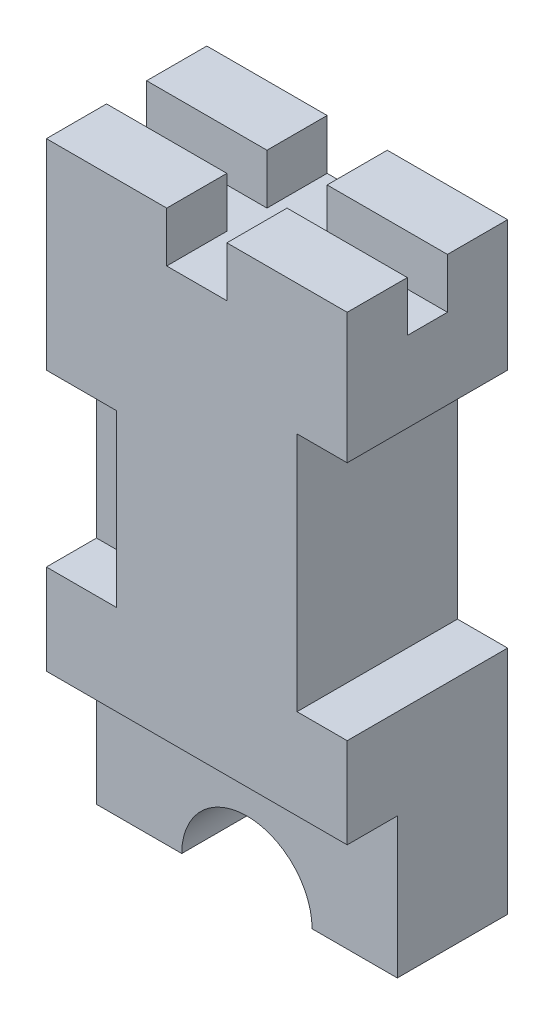
ISO-10303-21;
HEADER;
FILE_DESCRIPTION(('STEP AP214'),'2;1');
FILE_NAME('part.step','',(''),(''),'','','');
FILE_SCHEMA(('AUTOMOTIVE_DESIGN { 1 0 10303 214 1 1 1 1 }'));
ENDSEC;
DATA;
#1=APPLICATION_CONTEXT('core data for automotive mechanical design processes');
#2=APPLICATION_PROTOCOL_DEFINITION('international standard','automotive_design',2000,#1);
#3=PRODUCT_CONTEXT('',#1,'mechanical');
#4=PRODUCT('Part','Part','',(#3));
#5=PRODUCT_RELATED_PRODUCT_CATEGORY('part','',(#4));
#6=PRODUCT_DEFINITION_FORMATION('','',#4);
#7=PRODUCT_DEFINITION_CONTEXT('part definition',#1,'design');
#8=PRODUCT_DEFINITION('design','',#6,#7);
#9=PRODUCT_DEFINITION_SHAPE('','',#8);
#10=(LENGTH_UNIT() NAMED_UNIT(*) SI_UNIT(.MILLI.,.METRE.));
#11=(NAMED_UNIT(*) PLANE_ANGLE_UNIT() SI_UNIT($,.RADIAN.));
#12=(NAMED_UNIT(*) SI_UNIT($,.STERADIAN.) SOLID_ANGLE_UNIT());
#13=UNCERTAINTY_MEASURE_WITH_UNIT(LENGTH_MEASURE(1.E-05),#10,'distance_accuracy_value','');
#14=(GEOMETRIC_REPRESENTATION_CONTEXT(3) GLOBAL_UNCERTAINTY_ASSIGNED_CONTEXT((#13)) GLOBAL_UNIT_ASSIGNED_CONTEXT((#10,
#11,#12)) REPRESENTATION_CONTEXT('',''));
#15=CARTESIAN_POINT('',(0.,0.,0.));
#16=DIRECTION('',(0.,0.,1.));
#17=DIRECTION('',(1.,0.,0.));
#18=AXIS2_PLACEMENT_3D('',#15,#16,#17);
#19=CARTESIAN_POINT('',(15.,-30.,16.));
#20=DIRECTION('',(-1.,0.,0.));
#21=DIRECTION('',(0.,0.,1.));
#22=AXIS2_PLACEMENT_3D('',#19,#20,#21);
#23=PLANE('',#22);
#24=DIRECTION('',(0.,0.,1.));
#25=VECTOR('',#24,1.);
#26=CARTESIAN_POINT('',(15.,17.,0.));
#27=LINE('',#26,#25);
#28=CARTESIAN_POINT('',(15.,17.,0.));
#29=VERTEX_POINT('',#28);
#30=CARTESIAN_POINT('',(15.,17.,16.));
#31=VERTEX_POINT('',#30);
#32=EDGE_CURVE('E219',#29,#31,#27,.T.);
#33=ORIENTED_EDGE('',*,*,#32,.F.);
#34=DIRECTION('',(0.,1.,0.));
#35=VECTOR('',#34,1.);
#36=CARTESIAN_POINT('',(15.,-30.,0.));
#37=LINE('',#36,#35);
#38=CARTESIAN_POINT('',(15.,30.,0.));
#39=VERTEX_POINT('',#38);
#40=EDGE_CURVE('E268',#29,#39,#37,.T.);
#41=ORIENTED_EDGE('',*,*,#40,.T.);
#42=DIRECTION('',(0.,0.,-1.));
#43=VECTOR('',#42,1.);
#44=CARTESIAN_POINT('',(15.,30.,16.));
#45=LINE('',#44,#43);
#46=CARTESIAN_POINT('',(15.,30.,6.));
#47=VERTEX_POINT('',#46);
#48=EDGE_CURVE('E283',#47,#39,#45,.T.);
#49=ORIENTED_EDGE('',*,*,#48,.F.);
#50=DIRECTION('',(0.,-1.,0.));
#51=VECTOR('',#50,1.);
#52=CARTESIAN_POINT('',(15.,25.,6.));
#53=LINE('',#52,#51);
#54=CARTESIAN_POINT('',(15.,25.,6.));
#55=VERTEX_POINT('',#54);
#56=EDGE_CURVE('E327',#47,#55,#53,.T.);
#57=ORIENTED_EDGE('',*,*,#56,.T.);
#58=DIRECTION('',(0.,0.,1.));
#59=VECTOR('',#58,1.);
#60=CARTESIAN_POINT('',(15.,25.,6.));
#61=LINE('',#60,#59);
#62=CARTESIAN_POINT('',(15.,25.,10.));
#63=VERTEX_POINT('',#62);
#64=EDGE_CURVE('E305',#55,#63,#61,.T.);
#65=ORIENTED_EDGE('',*,*,#64,.T.);
#66=DIRECTION('',(0.,1.,0.));
#67=VECTOR('',#66,1.);
#68=CARTESIAN_POINT('',(15.,25.,10.));
#69=LINE('',#68,#67);
#70=CARTESIAN_POINT('',(15.,30.,10.));
#71=VERTEX_POINT('',#70);
#72=EDGE_CURVE('E329',#63,#71,#69,.T.);
#73=ORIENTED_EDGE('',*,*,#72,.T.);
#74=CARTESIAN_POINT('',(15.,30.,16.));
#75=VERTEX_POINT('',#74);
#76=EDGE_CURVE('E244',#75,#71,#45,.T.);
#77=ORIENTED_EDGE('',*,*,#76,.F.);
#78=DIRECTION('',(0.,1.,0.));
#79=VECTOR('',#78,1.);
#80=CARTESIAN_POINT('',(15.,-30.,16.));
#81=LINE('',#80,#79);
#82=EDGE_CURVE('E233',#31,#75,#81,.T.);
#83=ORIENTED_EDGE('',*,*,#82,.F.);
#84=EDGE_LOOP('',(#33,#41,#49,#57,#65,#73,#77,#83));
#85=FACE_BOUND('',#84,.T.);
#86=ADVANCED_FACE('F35',(#85),#23,.F.);
#87=CARTESIAN_POINT('',(15.,-30.,0.));
#88=VERTEX_POINT('',#87);
#89=CARTESIAN_POINT('',(15.,-7.,0.));
#90=VERTEX_POINT('',#89);
#91=EDGE_CURVE('E264',#88,#90,#37,.T.);
#92=ORIENTED_EDGE('',*,*,#91,.T.);
#93=DIRECTION('',(0.,0.,1.));
#94=VECTOR('',#93,1.);
#95=CARTESIAN_POINT('',(15.,-7.,0.));
#96=LINE('',#95,#94);
#97=CARTESIAN_POINT('',(15.,-7.,16.));
#98=VERTEX_POINT('',#97);
#99=EDGE_CURVE('E405',#90,#98,#96,.T.);
#100=ORIENTED_EDGE('',*,*,#99,.T.);
#101=CARTESIAN_POINT('',(15.,-16.,16.));
#102=VERTEX_POINT('',#101);
#103=EDGE_CURVE('E245',#102,#98,#81,.T.);
#104=ORIENTED_EDGE('',*,*,#103,.F.);
#105=DIRECTION('',(0.,0.,-1.));
#106=VECTOR('',#105,1.);
#107=CARTESIAN_POINT('',(15.,-16.,16.));
#108=LINE('',#107,#106);
#109=CARTESIAN_POINT('',(15.,-16.,11.));
#110=VERTEX_POINT('',#109);
#111=EDGE_CURVE('E355',#102,#110,#108,.T.);
#112=ORIENTED_EDGE('',*,*,#111,.T.);
#113=DIRECTION('',(0.,-1.,0.));
#114=VECTOR('',#113,1.);
#115=CARTESIAN_POINT('',(15.,-30.,11.));
#116=LINE('',#115,#114);
#117=CARTESIAN_POINT('',(15.,-30.,11.));
#118=VERTEX_POINT('',#117);
#119=EDGE_CURVE('E347',#110,#118,#116,.T.);
#120=ORIENTED_EDGE('',*,*,#119,.T.);
#121=DIRECTION('',(0.,0.,-1.));
#122=VECTOR('',#121,1.);
#123=CARTESIAN_POINT('',(15.,-30.,16.));
#124=LINE('',#123,#122);
#125=EDGE_CURVE('E263',#118,#88,#124,.T.);
#126=ORIENTED_EDGE('',*,*,#125,.T.);
#127=EDGE_LOOP('',(#92,#100,#104,#112,#120,#126));
#128=FACE_BOUND('',#127,.T.);
#129=ADVANCED_FACE('F489',(#128),#23,.F.);
#130=CARTESIAN_POINT('',(-15.,-30.,16.));
#131=DIRECTION('',(0.,1.,0.));
#132=DIRECTION('',(0.,0.,1.));
#133=AXIS2_PLACEMENT_3D('',#130,#131,#132);
#134=PLANE('',#133);
#135=DIRECTION('',(1.,0.,0.));
#136=VECTOR('',#135,1.);
#137=CARTESIAN_POINT('',(-15.,-30.,0.));
#138=LINE('',#137,#136);
#139=CARTESIAN_POINT('',(-15.,-30.,0.));
#140=VERTEX_POINT('',#139);
#141=CARTESIAN_POINT('',(-6.5,-30.,0.));
#142=VERTEX_POINT('',#141);
#143=EDGE_CURVE('E246',#140,#142,#138,.T.);
#144=ORIENTED_EDGE('',*,*,#143,.T.);
#145=DIRECTION('',(0.,0.,1.));
#146=VECTOR('',#145,1.);
#147=CARTESIAN_POINT('',(-6.5,-30.,0.));
#148=LINE('',#147,#146);
#149=CARTESIAN_POINT('',(-6.5,-30.,11.));
#150=VERTEX_POINT('',#149);
#151=EDGE_CURVE('E390',#142,#150,#148,.T.);
#152=ORIENTED_EDGE('',*,*,#151,.T.);
#153=DIRECTION('',(-1.,0.,0.));
#154=VECTOR('',#153,1.);
#155=CARTESIAN_POINT('',(15.,-30.,11.));
#156=LINE('',#155,#154);
#157=CARTESIAN_POINT('',(-15.,-30.,11.));
#158=VERTEX_POINT('',#157);
#159=EDGE_CURVE('E349',#150,#158,#156,.T.);
#160=ORIENTED_EDGE('',*,*,#159,.T.);
#161=DIRECTION('',(0.,0.,-1.));
#162=VECTOR('',#161,1.);
#163=CARTESIAN_POINT('',(-15.,-30.,16.));
#164=LINE('',#163,#162);
#165=EDGE_CURVE('E277',#158,#140,#164,.T.);
#166=ORIENTED_EDGE('',*,*,#165,.T.);
#167=EDGE_LOOP('',(#144,#152,#160,#166));
#168=FACE_BOUND('',#167,.T.);
#169=ADVANCED_FACE('F504',(#168),#134,.F.);
#170=CARTESIAN_POINT('',(-15.,30.,16.));
#171=DIRECTION('',(0.,-1.,0.));
#172=DIRECTION('',(0.,0.,-1.));
#173=AXIS2_PLACEMENT_3D('',#170,#171,#172);
#174=PLANE('',#173);
#175=DIRECTION('',(-1.,0.,0.));
#176=VECTOR('',#175,1.);
#177=CARTESIAN_POINT('',(15.,30.,10.));
#178=LINE('',#177,#176);
#179=CARTESIAN_POINT('',(3.,30.,10.));
#180=VERTEX_POINT('',#179);
#181=EDGE_CURVE('E255',#71,#180,#178,.T.);
#182=ORIENTED_EDGE('',*,*,#181,.T.);
#183=DIRECTION('',(0.,0.,1.));
#184=VECTOR('',#183,1.);
#185=CARTESIAN_POINT('',(3.,30.,0.));
#186=LINE('',#185,#184);
#187=CARTESIAN_POINT('',(3.,30.,16.));
#188=VERTEX_POINT('',#187);
#189=EDGE_CURVE('E372',#180,#188,#186,.T.);
#190=ORIENTED_EDGE('',*,*,#189,.T.);
#191=DIRECTION('',(-1.,0.,0.));
#192=VECTOR('',#191,1.);
#193=CARTESIAN_POINT('',(-15.,30.,16.));
#194=LINE('',#193,#192);
#195=EDGE_CURVE('E257',#75,#188,#194,.T.);
#196=ORIENTED_EDGE('',*,*,#195,.F.);
#197=ORIENTED_EDGE('',*,*,#76,.T.);
#198=EDGE_LOOP('',(#182,#190,#196,#197));
#199=FACE_BOUND('',#198,.T.);
#200=ADVANCED_FACE('F461',(#199),#174,.F.);
#201=DIRECTION('',(-1.,0.,0.));
#202=VECTOR('',#201,1.);
#203=CARTESIAN_POINT('',(-15.,30.,0.));
#204=LINE('',#203,#202);
#205=CARTESIAN_POINT('',(3.,30.,0.));
#206=VERTEX_POINT('',#205);
#207=EDGE_CURVE('E269',#39,#206,#204,.T.);
#208=ORIENTED_EDGE('',*,*,#207,.T.);
#209=CARTESIAN_POINT('',(3.,30.,6.));
#210=VERTEX_POINT('',#209);
#211=EDGE_CURVE('E369',#206,#210,#186,.T.);
#212=ORIENTED_EDGE('',*,*,#211,.T.);
#213=DIRECTION('',(-1.,0.,0.));
#214=VECTOR('',#213,1.);
#215=CARTESIAN_POINT('',(15.,30.,6.));
#216=LINE('',#215,#214);
#217=EDGE_CURVE('E295',#47,#210,#216,.T.);
#218=ORIENTED_EDGE('',*,*,#217,.F.);
#219=ORIENTED_EDGE('',*,*,#48,.T.);
#220=EDGE_LOOP('',(#208,#212,#218,#219));
#221=FACE_BOUND('',#220,.T.);
#222=ADVANCED_FACE('F517',(#221),#174,.F.);
#223=CARTESIAN_POINT('',(15.,25.,10.));
#224=DIRECTION('',(0.,0.,1.));
#225=DIRECTION('',(1.,0.,0.));
#226=AXIS2_PLACEMENT_3D('',#223,#224,#225);
#227=PLANE('',#226);
#228=DIRECTION('',(-1.,0.,0.));
#229=VECTOR('',#228,1.);
#230=CARTESIAN_POINT('',(15.,25.,10.));
#231=LINE('',#230,#229);
#232=CARTESIAN_POINT('',(3.,25.,10.));
#233=VERTEX_POINT('',#232);
#234=EDGE_CURVE('E310',#63,#233,#231,.T.);
#235=ORIENTED_EDGE('',*,*,#234,.T.);
#236=DIRECTION('',(0.,1.,0.));
#237=VECTOR('',#236,1.);
#238=CARTESIAN_POINT('',(3.,25.,10.));
#239=LINE('',#238,#237);
#240=EDGE_CURVE('E359',#233,#180,#239,.T.);
#241=ORIENTED_EDGE('',*,*,#240,.T.);
#242=ORIENTED_EDGE('',*,*,#181,.F.);
#243=ORIENTED_EDGE('',*,*,#72,.F.);
#244=EDGE_LOOP('',(#235,#241,#242,#243));
#245=FACE_BOUND('',#244,.T.);
#246=ADVANCED_FACE('F455',(#245),#227,.F.);
#247=CARTESIAN_POINT('',(15.,25.,6.));
#248=DIRECTION('',(0.,0.,-1.));
#249=DIRECTION('',(-1.,0.,0.));
#250=AXIS2_PLACEMENT_3D('',#247,#248,#249);
#251=PLANE('',#250);
#252=ORIENTED_EDGE('',*,*,#217,.T.);
#253=DIRECTION('',(0.,-1.,0.));
#254=VECTOR('',#253,1.);
#255=CARTESIAN_POINT('',(3.,25.,6.));
#256=LINE('',#255,#254);
#257=CARTESIAN_POINT('',(3.,25.,6.));
#258=VERTEX_POINT('',#257);
#259=EDGE_CURVE('E42',#210,#258,#256,.T.);
#260=ORIENTED_EDGE('',*,*,#259,.T.);
#261=DIRECTION('',(-1.,0.,0.));
#262=VECTOR('',#261,1.);
#263=CARTESIAN_POINT('',(15.,25.,6.));
#264=LINE('',#263,#262);
#265=EDGE_CURVE('E292',#55,#258,#264,.T.);
#266=ORIENTED_EDGE('',*,*,#265,.F.);
#267=ORIENTED_EDGE('',*,*,#56,.F.);
#268=EDGE_LOOP('',(#252,#260,#266,#267));
#269=FACE_BOUND('',#268,.T.);
#270=ADVANCED_FACE('F291',(#269),#251,.F.);
#271=CARTESIAN_POINT('',(-3.,30.,16.));
#272=VERTEX_POINT('',#271);
#273=CARTESIAN_POINT('',(-15.,30.,16.));
#274=VERTEX_POINT('',#273);
#275=EDGE_CURVE('E249',#272,#274,#194,.T.);
#276=ORIENTED_EDGE('',*,*,#275,.F.);
#277=DIRECTION('',(0.,0.,1.));
#278=VECTOR('',#277,1.);
#279=CARTESIAN_POINT('',(-3.,30.,0.));
#280=LINE('',#279,#278);
#281=CARTESIAN_POINT('',(-3.,30.,10.));
#282=VERTEX_POINT('',#281);
#283=EDGE_CURVE('E371',#282,#272,#280,.T.);
#284=ORIENTED_EDGE('',*,*,#283,.F.);
#285=CARTESIAN_POINT('',(-15.,30.,10.));
#286=VERTEX_POINT('',#285);
#287=EDGE_CURVE('E319',#282,#286,#178,.T.);
#288=ORIENTED_EDGE('',*,*,#287,.T.);
#289=DIRECTION('',(0.,0.,-1.));
#290=VECTOR('',#289,1.);
#291=CARTESIAN_POINT('',(-15.,30.,16.));
#292=LINE('',#291,#290);
#293=EDGE_CURVE('E280',#274,#286,#292,.T.);
#294=ORIENTED_EDGE('',*,*,#293,.F.);
#295=EDGE_LOOP('',(#276,#284,#288,#294));
#296=FACE_BOUND('',#295,.T.);
#297=ADVANCED_FACE('F465',(#296),#174,.F.);
#298=CARTESIAN_POINT('',(-3.,30.,6.));
#299=VERTEX_POINT('',#298);
#300=CARTESIAN_POINT('',(-15.,30.,6.));
#301=VERTEX_POINT('',#300);
#302=EDGE_CURVE('E313',#299,#301,#216,.T.);
#303=ORIENTED_EDGE('',*,*,#302,.F.);
#304=CARTESIAN_POINT('',(-3.,30.,0.));
#305=VERTEX_POINT('',#304);
#306=EDGE_CURVE('E373',#305,#299,#280,.T.);
#307=ORIENTED_EDGE('',*,*,#306,.F.);
#308=CARTESIAN_POINT('',(-15.,30.,0.));
#309=VERTEX_POINT('',#308);
#310=EDGE_CURVE('E267',#305,#309,#204,.T.);
#311=ORIENTED_EDGE('',*,*,#310,.T.);
#312=EDGE_CURVE('E279',#301,#309,#292,.T.);
#313=ORIENTED_EDGE('',*,*,#312,.F.);
#314=EDGE_LOOP('',(#303,#307,#311,#313));
#315=FACE_BOUND('',#314,.T.);
#316=ADVANCED_FACE('F510',(#315),#174,.F.);
#317=CARTESIAN_POINT('',(-15.,-30.,16.));
#318=DIRECTION('',(1.,0.,0.));
#319=DIRECTION('',(0.,0.,-1.));
#320=AXIS2_PLACEMENT_3D('',#317,#318,#319);
#321=PLANE('',#320);
#322=DIRECTION('',(0.,-1.,0.));
#323=VECTOR('',#322,1.);
#324=CARTESIAN_POINT('',(-15.,-7.00000000000001,11.));
#325=LINE('',#324,#323);
#326=CARTESIAN_POINT('',(-15.,10.,11.));
#327=VERTEX_POINT('',#326);
#328=CARTESIAN_POINT('',(-15.,-7.00000000000001,11.));
#329=VERTEX_POINT('',#328);
#330=EDGE_CURVE('E430',#327,#329,#325,.T.);
#331=ORIENTED_EDGE('',*,*,#330,.F.);
#332=DIRECTION('',(0.,0.,1.));
#333=VECTOR('',#332,1.);
#334=CARTESIAN_POINT('',(-15.,10.,11.));
#335=LINE('',#334,#333);
#336=CARTESIAN_POINT('',(-15.,10.,16.));
#337=VERTEX_POINT('',#336);
#338=EDGE_CURVE('E415',#327,#337,#335,.T.);
#339=ORIENTED_EDGE('',*,*,#338,.T.);
#340=DIRECTION('',(0.,-1.,0.));
#341=VECTOR('',#340,1.);
#342=CARTESIAN_POINT('',(-15.,-30.,16.));
#343=LINE('',#342,#341);
#344=EDGE_CURVE('E260',#274,#337,#343,.T.);
#345=ORIENTED_EDGE('',*,*,#344,.F.);
#346=ORIENTED_EDGE('',*,*,#293,.T.);
#347=DIRECTION('',(0.,1.,0.));
#348=VECTOR('',#347,1.);
#349=CARTESIAN_POINT('',(-15.,25.,10.));
#350=LINE('',#349,#348);
#351=CARTESIAN_POINT('',(-15.,25.,10.));
#352=VERTEX_POINT('',#351);
#353=EDGE_CURVE('E333',#352,#286,#350,.T.);
#354=ORIENTED_EDGE('',*,*,#353,.F.);
#355=DIRECTION('',(0.,0.,1.));
#356=VECTOR('',#355,1.);
#357=CARTESIAN_POINT('',(-15.,25.,6.));
#358=LINE('',#357,#356);
#359=CARTESIAN_POINT('',(-15.,25.,6.));
#360=VERTEX_POINT('',#359);
#361=EDGE_CURVE('E337',#360,#352,#358,.T.);
#362=ORIENTED_EDGE('',*,*,#361,.F.);
#363=DIRECTION('',(0.,-1.,0.));
#364=VECTOR('',#363,1.);
#365=CARTESIAN_POINT('',(-15.,25.,6.));
#366=LINE('',#365,#364);
#367=EDGE_CURVE('E335',#301,#360,#366,.T.);
#368=ORIENTED_EDGE('',*,*,#367,.F.);
#369=ORIENTED_EDGE('',*,*,#312,.T.);
#370=DIRECTION('',(0.,-1.,0.));
#371=VECTOR('',#370,1.);
#372=CARTESIAN_POINT('',(-15.,-30.,0.));
#373=LINE('',#372,#371);
#374=EDGE_CURVE('E272',#309,#140,#373,.T.);
#375=ORIENTED_EDGE('',*,*,#374,.T.);
#376=ORIENTED_EDGE('',*,*,#165,.F.);
#377=DIRECTION('',(0.,-1.,0.));
#378=VECTOR('',#377,1.);
#379=CARTESIAN_POINT('',(-15.,-30.,11.));
#380=LINE('',#379,#378);
#381=CARTESIAN_POINT('',(-15.,-16.,11.));
#382=VERTEX_POINT('',#381);
#383=EDGE_CURVE('E352',#382,#158,#380,.T.);
#384=ORIENTED_EDGE('',*,*,#383,.F.);
#385=DIRECTION('',(0.,0.,-1.));
#386=VECTOR('',#385,1.);
#387=CARTESIAN_POINT('',(-15.,-16.,16.));
#388=LINE('',#387,#386);
#389=CARTESIAN_POINT('',(-15.,-16.,16.));
#390=VERTEX_POINT('',#389);
#391=EDGE_CURVE('E356',#390,#382,#388,.T.);
#392=ORIENTED_EDGE('',*,*,#391,.F.);
#393=CARTESIAN_POINT('',(-15.,-7.00000000000001,16.));
#394=VERTEX_POINT('',#393);
#395=EDGE_CURVE('E259',#394,#390,#343,.T.);
#396=ORIENTED_EDGE('',*,*,#395,.F.);
#397=DIRECTION('',(0.,0.,1.));
#398=VECTOR('',#397,1.);
#399=CARTESIAN_POINT('',(-15.,-7.00000000000001,11.));
#400=LINE('',#399,#398);
#401=EDGE_CURVE('E49',#329,#394,#400,.T.);
#402=ORIENTED_EDGE('',*,*,#401,.F.);
#403=EDGE_LOOP('',(#331,#339,#345,#346,#354,#362,#368,#369,#375,#376,#384,#392,#396,#402));
#404=FACE_BOUND('',#403,.T.);
#405=ADVANCED_FACE('F469',(#404),#321,.F.);
#406=CARTESIAN_POINT('',(6.5,-30.,11.));
#407=VERTEX_POINT('',#406);
#408=EDGE_CURVE('E336',#118,#407,#156,.T.);
#409=ORIENTED_EDGE('',*,*,#408,.T.);
#410=DIRECTION('',(0.,0.,1.));
#411=VECTOR('',#410,1.);
#412=CARTESIAN_POINT('',(6.5,-30.,0.));
#413=LINE('',#412,#411);
#414=CARTESIAN_POINT('',(6.5,-30.,0.));
#415=VERTEX_POINT('',#414);
#416=EDGE_CURVE('E57',#407,#415,#413,.F.);
#417=ORIENTED_EDGE('',*,*,#416,.T.);
#418=EDGE_CURVE('E251',#415,#88,#138,.T.);
#419=ORIENTED_EDGE('',*,*,#418,.T.);
#420=ORIENTED_EDGE('',*,*,#125,.F.);
#421=EDGE_LOOP('',(#409,#417,#419,#420));
#422=FACE_BOUND('',#421,.T.);
#423=ADVANCED_FACE('F498',(#422),#134,.F.);
#424=CARTESIAN_POINT('',(0.,0.,16.));
#425=DIRECTION('',(0.,0.,-1.));
#426=DIRECTION('',(-1.,0.,0.));
#427=AXIS2_PLACEMENT_3D('',#424,#425,#426);
#428=PLANE('',#427);
#429=DIRECTION('',(0.,-1.,0.));
#430=VECTOR('',#429,1.);
#431=CARTESIAN_POINT('',(10.,-7.,16.));
#432=LINE('',#431,#430);
#433=CARTESIAN_POINT('',(10.,17.,16.));
#434=VERTEX_POINT('',#433);
#435=CARTESIAN_POINT('',(10.,-7.,16.));
#436=VERTEX_POINT('',#435);
#437=EDGE_CURVE('E237',#434,#436,#432,.T.);
#438=ORIENTED_EDGE('',*,*,#437,.F.);
#439=DIRECTION('',(-1.,0.,0.));
#440=VECTOR('',#439,1.);
#441=CARTESIAN_POINT('',(15.,17.,16.));
#442=LINE('',#441,#440);
#443=EDGE_CURVE('E223',#31,#434,#442,.T.);
#444=ORIENTED_EDGE('',*,*,#443,.F.);
#445=ORIENTED_EDGE('',*,*,#82,.T.);
#446=ORIENTED_EDGE('',*,*,#195,.T.);
#447=DIRECTION('',(0.,1.,0.));
#448=VECTOR('',#447,1.);
#449=CARTESIAN_POINT('',(3.,25.,16.));
#450=LINE('',#449,#448);
#451=CARTESIAN_POINT('',(3.,25.,16.));
#452=VERTEX_POINT('',#451);
#453=EDGE_CURVE('E388',#452,#188,#450,.T.);
#454=ORIENTED_EDGE('',*,*,#453,.F.);
#455=DIRECTION('',(1.,0.,0.));
#456=VECTOR('',#455,1.);
#457=CARTESIAN_POINT('',(-3.,25.,16.));
#458=LINE('',#457,#456);
#459=CARTESIAN_POINT('',(-3.,25.,16.));
#460=VERTEX_POINT('',#459);
#461=EDGE_CURVE('E381',#460,#452,#458,.T.);
#462=ORIENTED_EDGE('',*,*,#461,.F.);
#463=DIRECTION('',(0.,-1.,0.));
#464=VECTOR('',#463,1.);
#465=CARTESIAN_POINT('',(-3.,25.,16.));
#466=LINE('',#465,#464);
#467=EDGE_CURVE('E385',#272,#460,#466,.T.);
#468=ORIENTED_EDGE('',*,*,#467,.F.);
#469=ORIENTED_EDGE('',*,*,#275,.T.);
#470=ORIENTED_EDGE('',*,*,#344,.T.);
#471=DIRECTION('',(-1.,0.,0.));
#472=VECTOR('',#471,1.);
#473=CARTESIAN_POINT('',(-15.,10.,16.));
#474=LINE('',#473,#472);
#475=CARTESIAN_POINT('',(-8.,10.,16.));
#476=VERTEX_POINT('',#475);
#477=EDGE_CURVE('E428',#476,#337,#474,.T.);
#478=ORIENTED_EDGE('',*,*,#477,.F.);
#479=DIRECTION('',(0.,1.,0.));
#480=VECTOR('',#479,1.);
#481=CARTESIAN_POINT('',(-8.,-7.,16.));
#482=LINE('',#481,#480);
#483=CARTESIAN_POINT('',(-8.,-7.,16.));
#484=VERTEX_POINT('',#483);
#485=EDGE_CURVE('E431',#484,#476,#482,.T.);
#486=ORIENTED_EDGE('',*,*,#485,.F.);
#487=DIRECTION('',(1.,0.,0.));
#488=VECTOR('',#487,1.);
#489=CARTESIAN_POINT('',(-15.,-7.00000000000001,16.));
#490=LINE('',#489,#488);
#491=EDGE_CURVE('E434',#394,#484,#490,.T.);
#492=ORIENTED_EDGE('',*,*,#491,.F.);
#493=ORIENTED_EDGE('',*,*,#395,.T.);
#494=DIRECTION('',(-1.,0.,0.));
#495=VECTOR('',#494,1.);
#496=CARTESIAN_POINT('',(15.,-16.,16.));
#497=LINE('',#496,#495);
#498=EDGE_CURVE('E343',#102,#390,#497,.T.);
#499=ORIENTED_EDGE('',*,*,#498,.F.);
#500=ORIENTED_EDGE('',*,*,#103,.T.);
#501=DIRECTION('',(1.,0.,0.));
#502=VECTOR('',#501,1.);
#503=CARTESIAN_POINT('',(15.,-7.,16.));
#504=LINE('',#503,#502);
#505=EDGE_CURVE('E411',#436,#98,#504,.T.);
#506=ORIENTED_EDGE('',*,*,#505,.F.);
#507=EDGE_LOOP('',(#438,#444,#445,#446,#454,#462,#468,#469,#470,#478,#486,#492,#493,#499,#500,#506));
#508=FACE_BOUND('',#507,.T.);
#509=ADVANCED_FACE('F231',(#508),#428,.F.);
#510=CARTESIAN_POINT('',(0.,0.,0.));
#511=DIRECTION('',(0.,0.,-1.));
#512=DIRECTION('',(-1.,0.,0.));
#513=AXIS2_PLACEMENT_3D('',#510,#511,#512);
#514=PLANE('',#513);
#515=DIRECTION('',(1.,0.,0.));
#516=VECTOR('',#515,1.);
#517=CARTESIAN_POINT('',(10.,17.,0.));
#518=LINE('',#517,#516);
#519=CARTESIAN_POINT('',(10.,17.,0.));
#520=VERTEX_POINT('',#519);
#521=EDGE_CURVE('E225',#520,#29,#518,.T.);
#522=ORIENTED_EDGE('',*,*,#521,.F.);
#523=DIRECTION('',(0.,-1.,0.));
#524=VECTOR('',#523,1.);
#525=CARTESIAN_POINT('',(10.,-7.,0.));
#526=LINE('',#525,#524);
#527=CARTESIAN_POINT('',(10.,-7.,0.));
#528=VERTEX_POINT('',#527);
#529=EDGE_CURVE('E413',#520,#528,#526,.T.);
#530=ORIENTED_EDGE('',*,*,#529,.T.);
#531=DIRECTION('',(1.,0.,0.));
#532=VECTOR('',#531,1.);
#533=CARTESIAN_POINT('',(15.,-7.,0.));
#534=LINE('',#533,#532);
#535=EDGE_CURVE('E408',#528,#90,#534,.T.);
#536=ORIENTED_EDGE('',*,*,#535,.T.);
#537=ORIENTED_EDGE('',*,*,#91,.F.);
#538=ORIENTED_EDGE('',*,*,#418,.F.);
#539=CARTESIAN_POINT('',(0.,-30.,0.));
#540=DIRECTION('',(0.,0.,1.));
#541=DIRECTION('',(1.,0.,0.));
#542=AXIS2_PLACEMENT_3D('',#539,#540,#541);
#543=CIRCLE('',#542,6.5);
#544=EDGE_CURVE('E402',#415,#142,#543,.T.);
#545=ORIENTED_EDGE('',*,*,#544,.T.);
#546=ORIENTED_EDGE('',*,*,#143,.F.);
#547=ORIENTED_EDGE('',*,*,#374,.F.);
#548=ORIENTED_EDGE('',*,*,#310,.F.);
#549=DIRECTION('',(0.,-1.,0.));
#550=VECTOR('',#549,1.);
#551=CARTESIAN_POINT('',(-3.,25.,0.));
#552=LINE('',#551,#550);
#553=CARTESIAN_POINT('',(-3.,25.,0.));
#554=VERTEX_POINT('',#553);
#555=EDGE_CURVE('E394',#305,#554,#552,.T.);
#556=ORIENTED_EDGE('',*,*,#555,.T.);
#557=DIRECTION('',(1.,0.,0.));
#558=VECTOR('',#557,1.);
#559=CARTESIAN_POINT('',(-3.,25.,0.));
#560=LINE('',#559,#558);
#561=CARTESIAN_POINT('',(3.,25.,0.));
#562=VERTEX_POINT('',#561);
#563=EDGE_CURVE('E391',#554,#562,#560,.T.);
#564=ORIENTED_EDGE('',*,*,#563,.T.);
#565=DIRECTION('',(0.,1.,0.));
#566=VECTOR('',#565,1.);
#567=CARTESIAN_POINT('',(3.,25.,0.));
#568=LINE('',#567,#566);
#569=EDGE_CURVE('E384',#562,#206,#568,.T.);
#570=ORIENTED_EDGE('',*,*,#569,.T.);
#571=ORIENTED_EDGE('',*,*,#207,.F.);
#572=ORIENTED_EDGE('',*,*,#40,.F.);
#573=EDGE_LOOP('',(#522,#530,#536,#537,#538,#545,#546,#547,#548,#556,#564,#570,#571,#572));
#574=FACE_BOUND('',#573,.T.);
#575=ADVANCED_FACE('F449',(#574),#514,.T.);
#576=ORIENTED_EDGE('',*,*,#287,.F.);
#577=DIRECTION('',(0.,-1.,0.));
#578=VECTOR('',#577,1.);
#579=CARTESIAN_POINT('',(-3.,25.,10.));
#580=LINE('',#579,#578);
#581=CARTESIAN_POINT('',(-3.,25.,10.));
#582=VERTEX_POINT('',#581);
#583=EDGE_CURVE('E366',#282,#582,#580,.T.);
#584=ORIENTED_EDGE('',*,*,#583,.T.);
#585=EDGE_CURVE('E307',#582,#352,#231,.T.);
#586=ORIENTED_EDGE('',*,*,#585,.T.);
#587=ORIENTED_EDGE('',*,*,#353,.T.);
#588=EDGE_LOOP('',(#576,#584,#586,#587));
#589=FACE_BOUND('',#588,.T.);
#590=ADVANCED_FACE('F562',(#589),#227,.F.);
#591=CARTESIAN_POINT('',(15.,25.,6.));
#592=DIRECTION('',(0.,-1.,0.));
#593=DIRECTION('',(0.,0.,-1.));
#594=AXIS2_PLACEMENT_3D('',#591,#592,#593);
#595=PLANE('',#594);
#596=ORIENTED_EDGE('',*,*,#585,.F.);
#597=DIRECTION('',(0.,0.,1.));
#598=VECTOR('',#597,1.);
#599=CARTESIAN_POINT('',(-3.,25.,0.));
#600=LINE('',#599,#598);
#601=EDGE_CURVE('E375',#582,#460,#600,.T.);
#602=ORIENTED_EDGE('',*,*,#601,.T.);
#603=ORIENTED_EDGE('',*,*,#461,.T.);
#604=DIRECTION('',(0.,0.,1.));
#605=VECTOR('',#604,1.);
#606=CARTESIAN_POINT('',(3.,25.,0.));
#607=LINE('',#606,#605);
#608=EDGE_CURVE('E379',#233,#452,#607,.T.);
#609=ORIENTED_EDGE('',*,*,#608,.F.);
#610=ORIENTED_EDGE('',*,*,#234,.F.);
#611=ORIENTED_EDGE('',*,*,#64,.F.);
#612=ORIENTED_EDGE('',*,*,#265,.T.);
#613=EDGE_CURVE('E302',#562,#258,#607,.T.);
#614=ORIENTED_EDGE('',*,*,#613,.F.);
#615=ORIENTED_EDGE('',*,*,#563,.F.);
#616=CARTESIAN_POINT('',(-3.,25.,6.));
#617=VERTEX_POINT('',#616);
#618=EDGE_CURVE('E376',#554,#617,#600,.T.);
#619=ORIENTED_EDGE('',*,*,#618,.T.);
#620=EDGE_CURVE('E308',#617,#360,#264,.T.);
#621=ORIENTED_EDGE('',*,*,#620,.T.);
#622=ORIENTED_EDGE('',*,*,#361,.T.);
#623=EDGE_LOOP('',(#596,#602,#603,#609,#610,#611,#612,#614,#615,#619,#621,#622));
#624=FACE_BOUND('',#623,.T.);
#625=ADVANCED_FACE('F300',(#624),#595,.F.);
#626=ORIENTED_EDGE('',*,*,#620,.F.);
#627=DIRECTION('',(0.,1.,0.));
#628=VECTOR('',#627,1.);
#629=CARTESIAN_POINT('',(-3.,25.,6.));
#630=LINE('',#629,#628);
#631=EDGE_CURVE('E285',#617,#299,#630,.T.);
#632=ORIENTED_EDGE('',*,*,#631,.T.);
#633=ORIENTED_EDGE('',*,*,#302,.T.);
#634=ORIENTED_EDGE('',*,*,#367,.T.);
#635=EDGE_LOOP('',(#626,#632,#633,#634));
#636=FACE_BOUND('',#635,.T.);
#637=ADVANCED_FACE('F515',(#636),#251,.F.);
#638=CARTESIAN_POINT('',(15.,-30.,11.));
#639=DIRECTION('',(0.,0.,-1.));
#640=DIRECTION('',(-1.,0.,0.));
#641=AXIS2_PLACEMENT_3D('',#638,#639,#640);
#642=PLANE('',#641);
#643=ORIENTED_EDGE('',*,*,#159,.F.);
#644=CARTESIAN_POINT('',(0.,-30.,11.));
#645=DIRECTION('',(0.,0.,-1.));
#646=DIRECTION('',(-1.,0.,0.));
#647=AXIS2_PLACEMENT_3D('',#644,#645,#646);
#648=CIRCLE('',#647,6.5);
#649=EDGE_CURVE('E12',#150,#407,#648,.T.);
#650=ORIENTED_EDGE('',*,*,#649,.T.);
#651=ORIENTED_EDGE('',*,*,#408,.F.);
#652=ORIENTED_EDGE('',*,*,#119,.F.);
#653=DIRECTION('',(-1.,0.,0.));
#654=VECTOR('',#653,1.);
#655=CARTESIAN_POINT('',(15.,-16.,11.));
#656=LINE('',#655,#654);
#657=EDGE_CURVE('E346',#110,#382,#656,.T.);
#658=ORIENTED_EDGE('',*,*,#657,.T.);
#659=ORIENTED_EDGE('',*,*,#383,.T.);
#660=EDGE_LOOP('',(#643,#650,#651,#652,#658,#659));
#661=FACE_BOUND('',#660,.T.);
#662=ADVANCED_FACE('F501',(#661),#642,.F.);
#663=CARTESIAN_POINT('',(15.,-16.,16.));
#664=DIRECTION('',(0.,1.,0.));
#665=DIRECTION('',(0.,0.,1.));
#666=AXIS2_PLACEMENT_3D('',#663,#664,#665);
#667=PLANE('',#666);
#668=ORIENTED_EDGE('',*,*,#391,.T.);
#669=ORIENTED_EDGE('',*,*,#657,.F.);
#670=ORIENTED_EDGE('',*,*,#111,.F.);
#671=ORIENTED_EDGE('',*,*,#498,.T.);
#672=EDGE_LOOP('',(#668,#669,#670,#671));
#673=FACE_BOUND('',#672,.T.);
#674=ADVANCED_FACE('F485',(#673),#667,.F.);
#675=CARTESIAN_POINT('',(-3.,25.,0.));
#676=DIRECTION('',(-1.,0.,0.));
#677=DIRECTION('',(0.,0.,1.));
#678=AXIS2_PLACEMENT_3D('',#675,#676,#677);
#679=PLANE('',#678);
#680=ORIENTED_EDGE('',*,*,#618,.F.);
#681=ORIENTED_EDGE('',*,*,#555,.F.);
#682=ORIENTED_EDGE('',*,*,#306,.T.);
#683=ORIENTED_EDGE('',*,*,#631,.F.);
#684=EDGE_LOOP('',(#680,#681,#682,#683));
#685=FACE_BOUND('',#684,.T.);
#686=ADVANCED_FACE('F513',(#685),#679,.F.);
#687=CARTESIAN_POINT('',(3.,25.,0.));
#688=DIRECTION('',(1.,0.,0.));
#689=DIRECTION('',(0.,0.,-1.));
#690=AXIS2_PLACEMENT_3D('',#687,#688,#689);
#691=PLANE('',#690);
#692=ORIENTED_EDGE('',*,*,#211,.F.);
#693=ORIENTED_EDGE('',*,*,#569,.F.);
#694=ORIENTED_EDGE('',*,*,#613,.T.);
#695=ORIENTED_EDGE('',*,*,#259,.F.);
#696=EDGE_LOOP('',(#692,#693,#694,#695));
#697=FACE_BOUND('',#696,.T.);
#698=ADVANCED_FACE('F518',(#697),#691,.F.);
#699=ORIENTED_EDGE('',*,*,#608,.T.);
#700=ORIENTED_EDGE('',*,*,#453,.T.);
#701=ORIENTED_EDGE('',*,*,#189,.F.);
#702=ORIENTED_EDGE('',*,*,#240,.F.);
#703=EDGE_LOOP('',(#699,#700,#701,#702));
#704=FACE_BOUND('',#703,.T.);
#705=ADVANCED_FACE('F460',(#704),#691,.F.);
#706=ORIENTED_EDGE('',*,*,#283,.T.);
#707=ORIENTED_EDGE('',*,*,#467,.T.);
#708=ORIENTED_EDGE('',*,*,#601,.F.);
#709=ORIENTED_EDGE('',*,*,#583,.F.);
#710=EDGE_LOOP('',(#706,#707,#708,#709));
#711=FACE_BOUND('',#710,.T.);
#712=ADVANCED_FACE('F525',(#711),#679,.F.);
#713=CARTESIAN_POINT('',(0.,-30.,0.));
#714=DIRECTION('',(0.,0.,1.));
#715=DIRECTION('',(1.,0.,0.));
#716=AXIS2_PLACEMENT_3D('',#713,#714,#715);
#717=CYLINDRICAL_SURFACE('',#716,6.5);
#718=ORIENTED_EDGE('',*,*,#544,.F.);
#719=ORIENTED_EDGE('',*,*,#416,.F.);
#720=ORIENTED_EDGE('',*,*,#649,.F.);
#721=ORIENTED_EDGE('',*,*,#151,.F.);
#722=EDGE_LOOP('',(#718,#719,#720,#721));
#723=FACE_BOUND('',#722,.T.);
#724=ADVANCED_FACE('F502',(#723),#717,.F.);
#725=CARTESIAN_POINT('',(15.,-7.,0.));
#726=DIRECTION('',(0.,-1.,0.));
#727=DIRECTION('',(1.,0.,0.));
#728=AXIS2_PLACEMENT_3D('',#725,#726,#727);
#729=PLANE('',#728);
#730=ORIENTED_EDGE('',*,*,#505,.T.);
#731=ORIENTED_EDGE('',*,*,#99,.F.);
#732=ORIENTED_EDGE('',*,*,#535,.F.);
#733=DIRECTION('',(0.,0.,1.));
#734=VECTOR('',#733,1.);
#735=CARTESIAN_POINT('',(10.,-7.,0.));
#736=LINE('',#735,#734);
#737=EDGE_CURVE('E406',#528,#436,#736,.T.);
#738=ORIENTED_EDGE('',*,*,#737,.T.);
#739=EDGE_LOOP('',(#730,#731,#732,#738));
#740=FACE_BOUND('',#739,.T.);
#741=ADVANCED_FACE('F493',(#740),#729,.F.);
#742=CARTESIAN_POINT('',(10.,-7.,0.));
#743=DIRECTION('',(-1.,0.,0.));
#744=DIRECTION('',(0.,0.,1.));
#745=AXIS2_PLACEMENT_3D('',#742,#743,#744);
#746=PLANE('',#745);
#747=ORIENTED_EDGE('',*,*,#437,.T.);
#748=ORIENTED_EDGE('',*,*,#737,.F.);
#749=ORIENTED_EDGE('',*,*,#529,.F.);
#750=DIRECTION('',(0.,0.,-1.));
#751=VECTOR('',#750,1.);
#752=CARTESIAN_POINT('',(10.,17.,16.));
#753=LINE('',#752,#751);
#754=EDGE_CURVE('E239',#434,#520,#753,.T.);
#755=ORIENTED_EDGE('',*,*,#754,.F.);
#756=EDGE_LOOP('',(#747,#748,#749,#755));
#757=FACE_BOUND('',#756,.T.);
#758=ADVANCED_FACE('F578',(#757),#746,.F.);
#759=CARTESIAN_POINT('',(-15.,10.,11.));
#760=DIRECTION('',(0.,1.,0.));
#761=DIRECTION('',(0.,0.,1.));
#762=AXIS2_PLACEMENT_3D('',#759,#760,#761);
#763=PLANE('',#762);
#764=ORIENTED_EDGE('',*,*,#477,.T.);
#765=ORIENTED_EDGE('',*,*,#338,.F.);
#766=DIRECTION('',(-1.,0.,0.));
#767=VECTOR('',#766,1.);
#768=CARTESIAN_POINT('',(-15.,10.,11.));
#769=LINE('',#768,#767);
#770=CARTESIAN_POINT('',(-8.,10.,11.));
#771=VERTEX_POINT('',#770);
#772=EDGE_CURVE('E422',#771,#327,#769,.T.);
#773=ORIENTED_EDGE('',*,*,#772,.F.);
#774=DIRECTION('',(0.,0.,1.));
#775=VECTOR('',#774,1.);
#776=CARTESIAN_POINT('',(-8.,10.,11.));
#777=LINE('',#776,#775);
#778=EDGE_CURVE('E424',#771,#476,#777,.T.);
#779=ORIENTED_EDGE('',*,*,#778,.T.);
#780=EDGE_LOOP('',(#764,#765,#773,#779));
#781=FACE_BOUND('',#780,.T.);
#782=ADVANCED_FACE('F473',(#781),#763,.F.);
#783=CARTESIAN_POINT('',(-8.,-7.,11.));
#784=DIRECTION('',(1.,0.,0.));
#785=DIRECTION('',(0.,0.,-1.));
#786=AXIS2_PLACEMENT_3D('',#783,#784,#785);
#787=PLANE('',#786);
#788=ORIENTED_EDGE('',*,*,#485,.T.);
#789=ORIENTED_EDGE('',*,*,#778,.F.);
#790=DIRECTION('',(0.,1.,0.));
#791=VECTOR('',#790,1.);
#792=CARTESIAN_POINT('',(-8.,-7.,11.));
#793=LINE('',#792,#791);
#794=CARTESIAN_POINT('',(-8.,-7.,11.));
#795=VERTEX_POINT('',#794);
#796=EDGE_CURVE('E438',#795,#771,#793,.T.);
#797=ORIENTED_EDGE('',*,*,#796,.F.);
#798=DIRECTION('',(0.,0.,1.));
#799=VECTOR('',#798,1.);
#800=CARTESIAN_POINT('',(-8.,-7.,11.));
#801=LINE('',#800,#799);
#802=EDGE_CURVE('E421',#795,#484,#801,.T.);
#803=ORIENTED_EDGE('',*,*,#802,.T.);
#804=EDGE_LOOP('',(#788,#789,#797,#803));
#805=FACE_BOUND('',#804,.T.);
#806=ADVANCED_FACE('F477',(#805),#787,.F.);
#807=CARTESIAN_POINT('',(-15.,-7.00000000000001,11.));
#808=DIRECTION('',(0.,-1.,0.));
#809=DIRECTION('',(1.,0.,0.));
#810=AXIS2_PLACEMENT_3D('',#807,#808,#809);
#811=PLANE('',#810);
#812=ORIENTED_EDGE('',*,*,#491,.T.);
#813=ORIENTED_EDGE('',*,*,#802,.F.);
#814=DIRECTION('',(1.,0.,0.));
#815=VECTOR('',#814,1.);
#816=CARTESIAN_POINT('',(-15.,-7.00000000000001,11.));
#817=LINE('',#816,#815);
#818=EDGE_CURVE('E441',#329,#795,#817,.T.);
#819=ORIENTED_EDGE('',*,*,#818,.F.);
#820=ORIENTED_EDGE('',*,*,#401,.T.);
#821=EDGE_LOOP('',(#812,#813,#819,#820));
#822=FACE_BOUND('',#821,.T.);
#823=ADVANCED_FACE('F478',(#822),#811,.F.);
#824=CARTESIAN_POINT('',(0.,0.,11.));
#825=DIRECTION('',(0.,0.,-1.));
#826=DIRECTION('',(-1.,0.,0.));
#827=AXIS2_PLACEMENT_3D('',#824,#825,#826);
#828=PLANE('',#827);
#829=ORIENTED_EDGE('',*,*,#330,.T.);
#830=ORIENTED_EDGE('',*,*,#818,.T.);
#831=ORIENTED_EDGE('',*,*,#796,.T.);
#832=ORIENTED_EDGE('',*,*,#772,.T.);
#833=EDGE_LOOP('',(#829,#830,#831,#832));
#834=FACE_BOUND('',#833,.T.);
#835=ADVANCED_FACE('F585',(#834),#828,.F.);
#836=CARTESIAN_POINT('',(0.,17.,0.));
#837=DIRECTION('',(0.,-1.,0.));
#838=DIRECTION('',(0.,0.,-1.));
#839=AXIS2_PLACEMENT_3D('',#836,#837,#838);
#840=PLANE('',#839);
#841=ORIENTED_EDGE('',*,*,#32,.T.);
#842=ORIENTED_EDGE('',*,*,#443,.T.);
#843=ORIENTED_EDGE('',*,*,#754,.T.);
#844=ORIENTED_EDGE('',*,*,#521,.T.);
#845=EDGE_LOOP('',(#841,#842,#843,#844));
#846=FACE_BOUND('',#845,.T.);
#847=ADVANCED_FACE('F221',(#846),#840,.T.);
#848=CLOSED_SHELL('',(#86,#129,#169,#200,#222,#246,#270,#297,#316,#405,#423,#509,#575,#590,#625,
#637,#662,#674,#686,#698,#705,#712,#724,#741,#758,#782,#806,#823,#835,#847));
#849=MANIFOLD_SOLID_BREP('B2',#848);
#850=ADVANCED_BREP_SHAPE_REPRESENTATION('',(#18,#849),#14);
#851=SHAPE_DEFINITION_REPRESENTATION(#9,#850);
ENDSEC;
END-ISO-10303-21;
